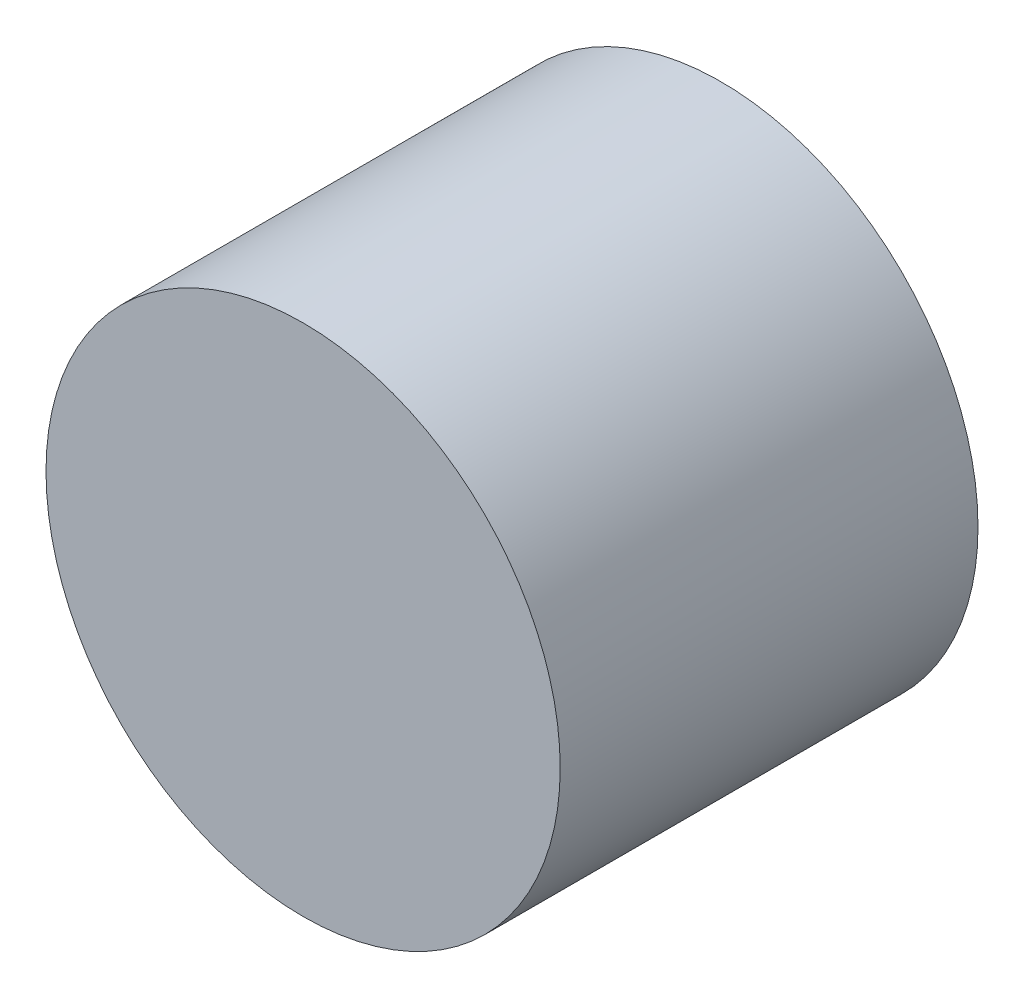
ISO-10303-21;
HEADER;
FILE_DESCRIPTION(('STEP AP214'),'2;1');
FILE_NAME('part.step','',(''),(''),'','','');
FILE_SCHEMA(('AUTOMOTIVE_DESIGN { 1 0 10303 214 1 1 1 1 }'));
ENDSEC;
DATA;
#1=APPLICATION_CONTEXT('core data for automotive mechanical design processes');
#2=APPLICATION_PROTOCOL_DEFINITION('international standard','automotive_design',2000,#1);
#3=PRODUCT_CONTEXT('',#1,'mechanical');
#4=PRODUCT('Part','Part','',(#3));
#5=PRODUCT_RELATED_PRODUCT_CATEGORY('part','',(#4));
#6=PRODUCT_DEFINITION_FORMATION('','',#4);
#7=PRODUCT_DEFINITION_CONTEXT('part definition',#1,'design');
#8=PRODUCT_DEFINITION('design','',#6,#7);
#9=PRODUCT_DEFINITION_SHAPE('','',#8);
#10=(LENGTH_UNIT() NAMED_UNIT(*) SI_UNIT(.MILLI.,.METRE.));
#11=(NAMED_UNIT(*) PLANE_ANGLE_UNIT() SI_UNIT($,.RADIAN.));
#12=(NAMED_UNIT(*) SI_UNIT($,.STERADIAN.) SOLID_ANGLE_UNIT());
#13=UNCERTAINTY_MEASURE_WITH_UNIT(LENGTH_MEASURE(1.E-05),#10,'distance_accuracy_value','');
#14=(GEOMETRIC_REPRESENTATION_CONTEXT(3) GLOBAL_UNCERTAINTY_ASSIGNED_CONTEXT((#13)) GLOBAL_UNIT_ASSIGNED_CONTEXT((#10,
#11,#12)) REPRESENTATION_CONTEXT('',''));
#15=CARTESIAN_POINT('',(0.,0.,0.));
#16=DIRECTION('',(0.,0.,1.));
#17=DIRECTION('',(1.,0.,0.));
#18=AXIS2_PLACEMENT_3D('',#15,#16,#17);
#19=CARTESIAN_POINT('',(111.482,7.03676,25.4));
#20=DIRECTION('',(0.,0.,1.));
#21=DIRECTION('',(1.,0.,0.));
#22=AXIS2_PLACEMENT_3D('',#19,#20,#21);
#23=PLANE('',#22);
#24=CARTESIAN_POINT('',(111.482,7.03676,25.4));
#25=DIRECTION('',(0.,0.,-1.));
#26=DIRECTION('',(-1.,0.,0.));
#27=AXIS2_PLACEMENT_3D('',#24,#25,#26);
#28=CIRCLE('',#27,8.);
#29=CARTESIAN_POINT('',(103.482,7.03676,25.4));
#30=VERTEX_POINT('',#29);
#31=EDGE_CURVE('E10',#30,#30,#28,.T.);
#32=ORIENTED_EDGE('',*,*,#31,.F.);
#33=EDGE_LOOP('',(#32));
#34=FACE_BOUND('',#33,.T.);
#35=ADVANCED_FACE('F15',(#34),#23,.T.);
#36=CARTESIAN_POINT('',(111.482,7.03676,12.4));
#37=DIRECTION('',(0.,0.,-1.));
#38=DIRECTION('',(-1.,0.,0.));
#39=AXIS2_PLACEMENT_3D('',#36,#37,#38);
#40=PLANE('',#39);
#41=CARTESIAN_POINT('',(111.482,7.03676,12.4));
#42=DIRECTION('',(0.,0.,-1.));
#43=DIRECTION('',(-1.,0.,0.));
#44=AXIS2_PLACEMENT_3D('',#41,#42,#43);
#45=CIRCLE('',#44,3.1);
#46=CARTESIAN_POINT('',(108.382,7.03676,12.4));
#47=VERTEX_POINT('',#46);
#48=EDGE_CURVE('E19',#47,#47,#45,.T.);
#49=ORIENTED_EDGE('',*,*,#48,.F.);
#50=EDGE_LOOP('',(#49));
#51=FACE_BOUND('',#50,.T.);
#52=CARTESIAN_POINT('',(111.482,7.03676,12.4));
#53=DIRECTION('',(0.,0.,1.));
#54=DIRECTION('',(1.,0.,0.));
#55=AXIS2_PLACEMENT_3D('',#52,#53,#54);
#56=CIRCLE('',#55,8.);
#57=CARTESIAN_POINT('',(119.482,7.03676,12.4));
#58=VERTEX_POINT('',#57);
#59=EDGE_CURVE('E24',#58,#58,#56,.T.);
#60=ORIENTED_EDGE('',*,*,#59,.F.);
#61=EDGE_LOOP('',(#60));
#62=FACE_BOUND('',#61,.T.);
#63=ADVANCED_FACE('F42',(#51,#62),#40,.T.);
#64=CARTESIAN_POINT('',(111.482,7.03676,12.4));
#65=DIRECTION('',(0.,0.,1.));
#66=DIRECTION('',(1.,0.,0.));
#67=AXIS2_PLACEMENT_3D('',#64,#65,#66);
#68=CYLINDRICAL_SURFACE('',#67,8.);
#69=ORIENTED_EDGE('',*,*,#31,.T.);
#70=EDGE_LOOP('',(#69));
#71=FACE_BOUND('',#70,.T.);
#72=ORIENTED_EDGE('',*,*,#59,.T.);
#73=EDGE_LOOP('',(#72));
#74=FACE_BOUND('',#73,.T.);
#75=ADVANCED_FACE('F17',(#71,#74),#68,.T.);
#76=CARTESIAN_POINT('',(111.482,7.03676,22.9));
#77=DIRECTION('',(0.,0.,1.));
#78=DIRECTION('',(1.,0.,0.));
#79=AXIS2_PLACEMENT_3D('',#76,#77,#78);
#80=PLANE('',#79);
#81=CARTESIAN_POINT('',(111.482,7.03676,22.9));
#82=DIRECTION('',(0.,0.,-1.));
#83=DIRECTION('',(-1.,0.,0.));
#84=AXIS2_PLACEMENT_3D('',#81,#82,#83);
#85=CIRCLE('',#84,3.1);
#86=CARTESIAN_POINT('',(108.382,7.03676,22.9));
#87=VERTEX_POINT('',#86);
#88=EDGE_CURVE('E31',#87,#87,#85,.T.);
#89=ORIENTED_EDGE('',*,*,#88,.T.);
#90=EDGE_LOOP('',(#89));
#91=FACE_BOUND('',#90,.T.);
#92=ADVANCED_FACE('F51',(#91),#80,.F.);
#93=CARTESIAN_POINT('',(111.482,7.03676,12.3));
#94=DIRECTION('',(0.,0.,1.));
#95=DIRECTION('',(1.,0.,0.));
#96=AXIS2_PLACEMENT_3D('',#93,#94,#95);
#97=CYLINDRICAL_SURFACE('',#96,3.1);
#98=ORIENTED_EDGE('',*,*,#48,.T.);
#99=EDGE_LOOP('',(#98));
#100=FACE_BOUND('',#99,.T.);
#101=ORIENTED_EDGE('',*,*,#88,.F.);
#102=EDGE_LOOP('',(#101));
#103=FACE_BOUND('',#102,.T.);
#104=ADVANCED_FACE('F41',(#100,#103),#97,.F.);
#105=CLOSED_SHELL('',(#35,#63,#75,#92,#104));
#106=MANIFOLD_SOLID_BREP('B1',#105);
#107=ADVANCED_BREP_SHAPE_REPRESENTATION('',(#18,#106),#14);
#108=SHAPE_DEFINITION_REPRESENTATION(#9,#107);
ENDSEC;
END-ISO-10303-21;
